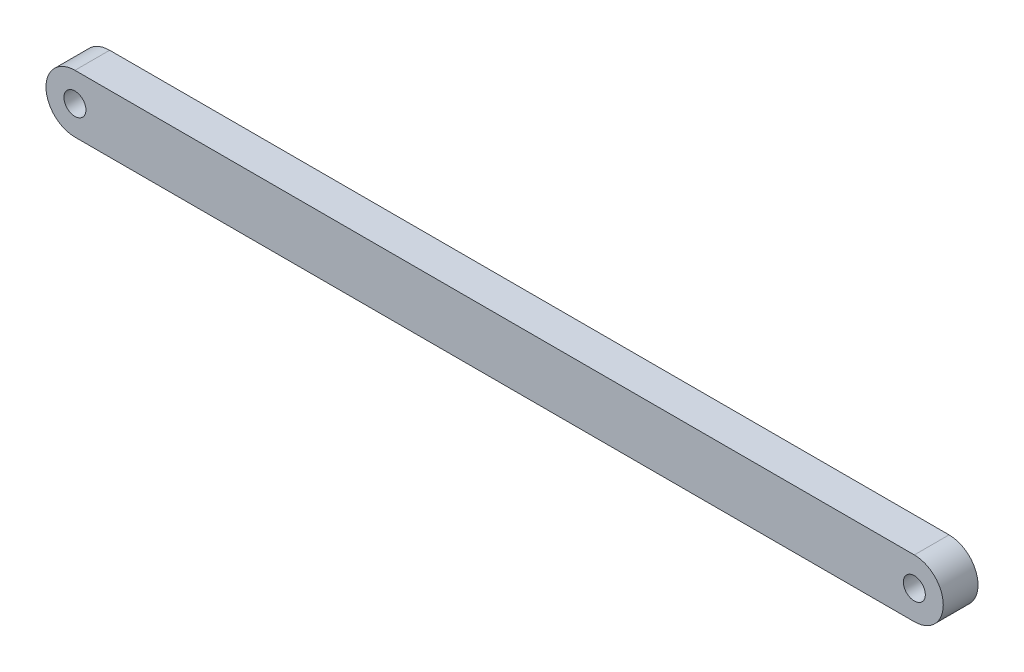
ISO-10303-21;
HEADER;
FILE_DESCRIPTION(('STEP AP214'),'2;1');
FILE_NAME('part.step','',(''),(''),'','','');
FILE_SCHEMA(('AUTOMOTIVE_DESIGN { 1 0 10303 214 1 1 1 1 }'));
ENDSEC;
DATA;
#1=APPLICATION_CONTEXT('core data for automotive mechanical design processes');
#2=APPLICATION_PROTOCOL_DEFINITION('international standard','automotive_design',2000,#1);
#3=PRODUCT_CONTEXT('',#1,'mechanical');
#4=PRODUCT('Part','Part','',(#3));
#5=PRODUCT_RELATED_PRODUCT_CATEGORY('part','',(#4));
#6=PRODUCT_DEFINITION_FORMATION('','',#4);
#7=PRODUCT_DEFINITION_CONTEXT('part definition',#1,'design');
#8=PRODUCT_DEFINITION('design','',#6,#7);
#9=PRODUCT_DEFINITION_SHAPE('','',#8);
#10=(LENGTH_UNIT() NAMED_UNIT(*) SI_UNIT(.MILLI.,.METRE.));
#11=(NAMED_UNIT(*) PLANE_ANGLE_UNIT() SI_UNIT($,.RADIAN.));
#12=(NAMED_UNIT(*) SI_UNIT($,.STERADIAN.) SOLID_ANGLE_UNIT());
#13=UNCERTAINTY_MEASURE_WITH_UNIT(LENGTH_MEASURE(1.E-05),#10,'distance_accuracy_value','');
#14=(GEOMETRIC_REPRESENTATION_CONTEXT(3) GLOBAL_UNCERTAINTY_ASSIGNED_CONTEXT((#13)) GLOBAL_UNIT_ASSIGNED_CONTEXT((#10,
#11,#12)) REPRESENTATION_CONTEXT('',''));
#15=CARTESIAN_POINT('',(0.,0.,0.));
#16=DIRECTION('',(0.,0.,1.));
#17=DIRECTION('',(1.,0.,0.));
#18=AXIS2_PLACEMENT_3D('',#15,#16,#17);
#19=CARTESIAN_POINT('',(72.5,0.,6.));
#20=DIRECTION('',(0.,0.,-1.));
#21=DIRECTION('',(-1.,0.,0.));
#22=AXIS2_PLACEMENT_3D('',#19,#20,#21);
#23=PLANE('',#22);
#24=CARTESIAN_POINT('',(72.5,0.,6.));
#25=DIRECTION('',(0.,0.,1.));
#26=DIRECTION('',(-1.,0.,0.));
#27=AXIS2_PLACEMENT_3D('',#24,#25,#26);
#28=CIRCLE('',#27,5.00000000000003);
#29=CARTESIAN_POINT('',(72.5,-5.00000000000003,6.));
#30=VERTEX_POINT('',#29);
#31=CARTESIAN_POINT('',(72.5,5.00000000000003,6.));
#32=VERTEX_POINT('',#31);
#33=EDGE_CURVE('E96',#30,#32,#28,.T.);
#34=ORIENTED_EDGE('',*,*,#33,.T.);
#35=DIRECTION('',(-1.,0.,0.));
#36=VECTOR('',#35,1.);
#37=CARTESIAN_POINT('',(-72.5,5.,6.));
#38=LINE('',#37,#36);
#39=CARTESIAN_POINT('',(-72.5,5.00000000000001,6.));
#40=VERTEX_POINT('',#39);
#41=EDGE_CURVE('E91',#32,#40,#38,.T.);
#42=ORIENTED_EDGE('',*,*,#41,.T.);
#43=CARTESIAN_POINT('',(-72.5,0.,6.));
#44=DIRECTION('',(0.,0.,1.));
#45=DIRECTION('',(1.,0.,0.));
#46=AXIS2_PLACEMENT_3D('',#43,#44,#45);
#47=CIRCLE('',#46,5.00000000000003);
#48=CARTESIAN_POINT('',(-72.5,-5.00000000000005,6.));
#49=VERTEX_POINT('',#48);
#50=EDGE_CURVE('E94',#40,#49,#47,.T.);
#51=ORIENTED_EDGE('',*,*,#50,.T.);
#52=DIRECTION('',(1.,0.,0.));
#53=VECTOR('',#52,1.);
#54=CARTESIAN_POINT('',(-72.5,-5.00000000000005,6.));
#55=LINE('',#54,#53);
#56=EDGE_CURVE('E61',#49,#30,#55,.T.);
#57=ORIENTED_EDGE('',*,*,#56,.T.);
#58=EDGE_LOOP('',(#34,#42,#51,#57));
#59=FACE_BOUND('',#58,.T.);
#60=CARTESIAN_POINT('',(-72.5,0.,6.));
#61=DIRECTION('',(0.,0.,1.));
#62=DIRECTION('',(1.,0.,0.));
#63=AXIS2_PLACEMENT_3D('',#60,#61,#62);
#64=CIRCLE('',#63,1.9);
#65=CARTESIAN_POINT('',(-70.6,0.,6.));
#66=VERTEX_POINT('',#65);
#67=EDGE_CURVE('E116',#66,#66,#64,.T.);
#68=ORIENTED_EDGE('',*,*,#67,.F.);
#69=EDGE_LOOP('',(#68));
#70=FACE_BOUND('',#69,.T.);
#71=CARTESIAN_POINT('',(72.5,0.,6.));
#72=DIRECTION('',(0.,0.,1.));
#73=DIRECTION('',(1.,0.,0.));
#74=AXIS2_PLACEMENT_3D('',#71,#72,#73);
#75=CIRCLE('',#74,1.9);
#76=CARTESIAN_POINT('',(74.4,0.,6.));
#77=VERTEX_POINT('',#76);
#78=EDGE_CURVE('E138',#77,#77,#75,.T.);
#79=ORIENTED_EDGE('',*,*,#78,.F.);
#80=EDGE_LOOP('',(#79));
#81=FACE_BOUND('',#80,.T.);
#82=ADVANCED_FACE('F43',(#59,#70,#81),#23,.F.);
#83=CARTESIAN_POINT('',(72.5,0.,0.));
#84=DIRECTION('',(0.,0.,-1.));
#85=DIRECTION('',(-1.,0.,0.));
#86=AXIS2_PLACEMENT_3D('',#83,#84,#85);
#87=PLANE('',#86);
#88=CARTESIAN_POINT('',(-72.5,0.,0.));
#89=DIRECTION('',(0.,0.,1.));
#90=DIRECTION('',(1.,0.,0.));
#91=AXIS2_PLACEMENT_3D('',#88,#89,#90);
#92=CIRCLE('',#91,1.9);
#93=CARTESIAN_POINT('',(-70.6,0.,0.));
#94=VERTEX_POINT('',#93);
#95=EDGE_CURVE('E134',#94,#94,#92,.T.);
#96=ORIENTED_EDGE('',*,*,#95,.T.);
#97=EDGE_LOOP('',(#96));
#98=FACE_BOUND('',#97,.T.);
#99=CARTESIAN_POINT('',(72.5,0.,0.));
#100=DIRECTION('',(0.,0.,1.));
#101=DIRECTION('',(-1.,0.,0.));
#102=AXIS2_PLACEMENT_3D('',#99,#100,#101);
#103=CIRCLE('',#102,5.00000000000003);
#104=CARTESIAN_POINT('',(72.5,-5.00000000000003,0.));
#105=VERTEX_POINT('',#104);
#106=CARTESIAN_POINT('',(72.5,5.00000000000003,0.));
#107=VERTEX_POINT('',#106);
#108=EDGE_CURVE('E112',#105,#107,#103,.T.);
#109=ORIENTED_EDGE('',*,*,#108,.F.);
#110=DIRECTION('',(1.,0.,0.));
#111=VECTOR('',#110,1.);
#112=CARTESIAN_POINT('',(-72.5,-5.00000000000005,0.));
#113=LINE('',#112,#111);
#114=CARTESIAN_POINT('',(-72.5,-5.00000000000005,0.));
#115=VERTEX_POINT('',#114);
#116=EDGE_CURVE('E84',#115,#105,#113,.T.);
#117=ORIENTED_EDGE('',*,*,#116,.F.);
#118=CARTESIAN_POINT('',(-72.5,0.,0.));
#119=DIRECTION('',(0.,0.,1.));
#120=DIRECTION('',(1.,0.,0.));
#121=AXIS2_PLACEMENT_3D('',#118,#119,#120);
#122=CIRCLE('',#121,5.00000000000003);
#123=CARTESIAN_POINT('',(-72.5,5.00000000000001,0.));
#124=VERTEX_POINT('',#123);
#125=EDGE_CURVE('E78',#124,#115,#122,.T.);
#126=ORIENTED_EDGE('',*,*,#125,.F.);
#127=DIRECTION('',(-1.,0.,0.));
#128=VECTOR('',#127,1.);
#129=CARTESIAN_POINT('',(-72.5,5.,0.));
#130=LINE('',#129,#128);
#131=EDGE_CURVE('E101',#107,#124,#130,.T.);
#132=ORIENTED_EDGE('',*,*,#131,.F.);
#133=EDGE_LOOP('',(#109,#117,#126,#132));
#134=FACE_BOUND('',#133,.T.);
#135=CARTESIAN_POINT('',(72.5,0.,0.));
#136=DIRECTION('',(0.,0.,1.));
#137=DIRECTION('',(1.,0.,0.));
#138=AXIS2_PLACEMENT_3D('',#135,#136,#137);
#139=CIRCLE('',#138,1.9);
#140=CARTESIAN_POINT('',(74.4,0.,0.));
#141=VERTEX_POINT('',#140);
#142=EDGE_CURVE('E142',#141,#141,#139,.T.);
#143=ORIENTED_EDGE('',*,*,#142,.T.);
#144=EDGE_LOOP('',(#143));
#145=FACE_BOUND('',#144,.T.);
#146=ADVANCED_FACE('F129',(#98,#134,#145),#87,.T.);
#147=CARTESIAN_POINT('',(72.5,0.,6.));
#148=DIRECTION('',(0.,0.,-1.));
#149=DIRECTION('',(-1.,0.,0.));
#150=AXIS2_PLACEMENT_3D('',#147,#148,#149);
#151=CYLINDRICAL_SURFACE('',#150,5.00000000000003);
#152=ORIENTED_EDGE('',*,*,#108,.T.);
#153=DIRECTION('',(0.,0.,-1.));
#154=VECTOR('',#153,1.);
#155=CARTESIAN_POINT('',(72.5,5.00000000000003,6.));
#156=LINE('',#155,#154);
#157=EDGE_CURVE('E11',#32,#107,#156,.T.);
#158=ORIENTED_EDGE('',*,*,#157,.F.);
#159=ORIENTED_EDGE('',*,*,#33,.F.);
#160=DIRECTION('',(0.,0.,-1.));
#161=VECTOR('',#160,1.);
#162=CARTESIAN_POINT('',(72.5,-5.00000000000003,6.));
#163=LINE('',#162,#161);
#164=EDGE_CURVE('E108',#30,#105,#163,.T.);
#165=ORIENTED_EDGE('',*,*,#164,.T.);
#166=EDGE_LOOP('',(#152,#158,#159,#165));
#167=FACE_BOUND('',#166,.T.);
#168=ADVANCED_FACE('F45',(#167),#151,.T.);
#169=CARTESIAN_POINT('',(-72.5,5.,6.));
#170=DIRECTION('',(0.,-1.,0.));
#171=DIRECTION('',(1.,0.,0.));
#172=AXIS2_PLACEMENT_3D('',#169,#170,#171);
#173=PLANE('',#172);
#174=ORIENTED_EDGE('',*,*,#131,.T.);
#175=DIRECTION('',(0.,0.,-1.));
#176=VECTOR('',#175,1.);
#177=CARTESIAN_POINT('',(-72.5,5.00000000000001,6.));
#178=LINE('',#177,#176);
#179=EDGE_CURVE('E53',#40,#124,#178,.T.);
#180=ORIENTED_EDGE('',*,*,#179,.F.);
#181=ORIENTED_EDGE('',*,*,#41,.F.);
#182=ORIENTED_EDGE('',*,*,#157,.T.);
#183=EDGE_LOOP('',(#174,#180,#181,#182));
#184=FACE_BOUND('',#183,.T.);
#185=ADVANCED_FACE('F100',(#184),#173,.F.);
#186=CARTESIAN_POINT('',(-72.5,0.,6.));
#187=DIRECTION('',(0.,0.,-1.));
#188=DIRECTION('',(-1.,0.,0.));
#189=AXIS2_PLACEMENT_3D('',#186,#187,#188);
#190=CYLINDRICAL_SURFACE('',#189,5.00000000000003);
#191=ORIENTED_EDGE('',*,*,#125,.T.);
#192=DIRECTION('',(0.,0.,-1.));
#193=VECTOR('',#192,1.);
#194=CARTESIAN_POINT('',(-72.5,-5.00000000000005,6.));
#195=LINE('',#194,#193);
#196=EDGE_CURVE('E103',#49,#115,#195,.T.);
#197=ORIENTED_EDGE('',*,*,#196,.F.);
#198=ORIENTED_EDGE('',*,*,#50,.F.);
#199=ORIENTED_EDGE('',*,*,#179,.T.);
#200=EDGE_LOOP('',(#191,#197,#198,#199));
#201=FACE_BOUND('',#200,.T.);
#202=ADVANCED_FACE('F104',(#201),#190,.T.);
#203=CARTESIAN_POINT('',(-72.5,-5.00000000000005,6.));
#204=DIRECTION('',(0.,1.,0.));
#205=DIRECTION('',(-1.,0.,0.));
#206=AXIS2_PLACEMENT_3D('',#203,#204,#205);
#207=PLANE('',#206);
#208=ORIENTED_EDGE('',*,*,#116,.T.);
#209=ORIENTED_EDGE('',*,*,#164,.F.);
#210=ORIENTED_EDGE('',*,*,#56,.F.);
#211=ORIENTED_EDGE('',*,*,#196,.T.);
#212=EDGE_LOOP('',(#208,#209,#210,#211));
#213=FACE_BOUND('',#212,.T.);
#214=ADVANCED_FACE('F126',(#213),#207,.F.);
#215=CARTESIAN_POINT('',(-72.5,0.,6.));
#216=DIRECTION('',(0.,0.,-1.));
#217=DIRECTION('',(-1.,0.,0.));
#218=AXIS2_PLACEMENT_3D('',#215,#216,#217);
#219=CYLINDRICAL_SURFACE('',#218,1.9);
#220=ORIENTED_EDGE('',*,*,#67,.T.);
#221=EDGE_LOOP('',(#220));
#222=FACE_BOUND('',#221,.T.);
#223=ORIENTED_EDGE('',*,*,#95,.F.);
#224=EDGE_LOOP('',(#223));
#225=FACE_BOUND('',#224,.T.);
#226=ADVANCED_FACE('F161',(#222,#225),#219,.F.);
#227=CARTESIAN_POINT('',(72.5,0.,6.));
#228=DIRECTION('',(0.,0.,-1.));
#229=DIRECTION('',(-1.,0.,0.));
#230=AXIS2_PLACEMENT_3D('',#227,#228,#229);
#231=CYLINDRICAL_SURFACE('',#230,1.9);
#232=ORIENTED_EDGE('',*,*,#78,.T.);
#233=EDGE_LOOP('',(#232));
#234=FACE_BOUND('',#233,.T.);
#235=ORIENTED_EDGE('',*,*,#142,.F.);
#236=EDGE_LOOP('',(#235));
#237=FACE_BOUND('',#236,.T.);
#238=ADVANCED_FACE('F150',(#234,#237),#231,.F.);
#239=CLOSED_SHELL('',(#82,#146,#168,#185,#202,#214,#226,#238));
#240=MANIFOLD_SOLID_BREP('B2',#239);
#241=ADVANCED_BREP_SHAPE_REPRESENTATION('',(#18,#240),#14);
#242=SHAPE_DEFINITION_REPRESENTATION(#9,#241);
ENDSEC;
END-ISO-10303-21;
